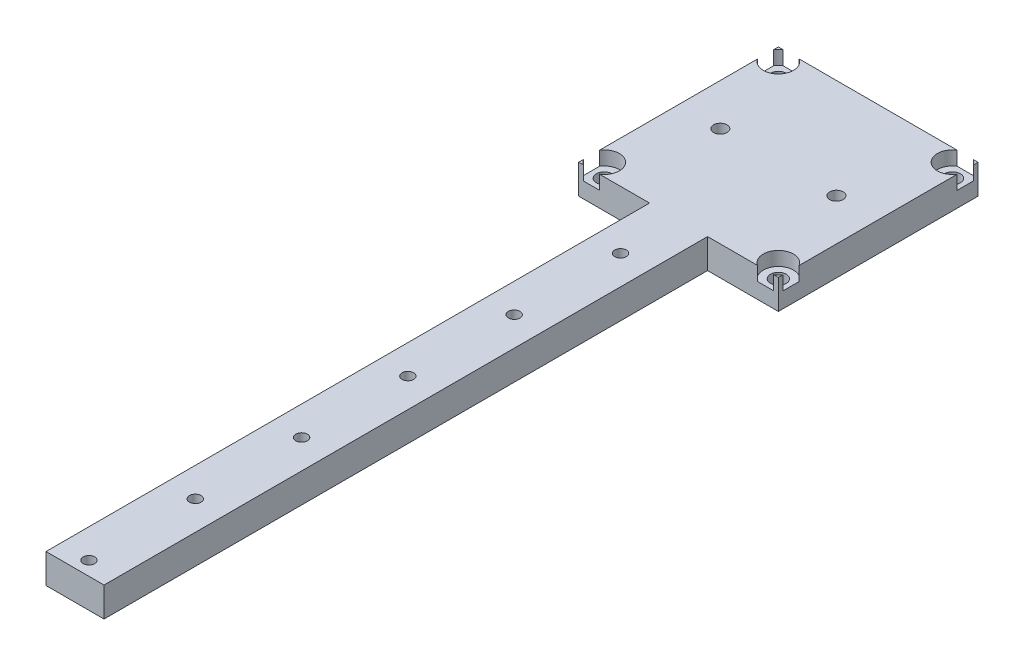
ISO-10303-21;
HEADER;
FILE_DESCRIPTION(('STEP AP214'),'2;1');
FILE_NAME('part.step','',(''),(''),'','','');
FILE_SCHEMA(('AUTOMOTIVE_DESIGN { 1 0 10303 214 1 1 1 1 }'));
ENDSEC;
DATA;
#1=APPLICATION_CONTEXT('core data for automotive mechanical design processes');
#2=APPLICATION_PROTOCOL_DEFINITION('international standard','automotive_design',2000,#1);
#3=PRODUCT_CONTEXT('',#1,'mechanical');
#4=PRODUCT('Part','Part','',(#3));
#5=PRODUCT_RELATED_PRODUCT_CATEGORY('part','',(#4));
#6=PRODUCT_DEFINITION_FORMATION('','',#4);
#7=PRODUCT_DEFINITION_CONTEXT('part definition',#1,'design');
#8=PRODUCT_DEFINITION('design','',#6,#7);
#9=PRODUCT_DEFINITION_SHAPE('','',#8);
#10=(LENGTH_UNIT() NAMED_UNIT(*) SI_UNIT(.MILLI.,.METRE.));
#11=(NAMED_UNIT(*) PLANE_ANGLE_UNIT() SI_UNIT($,.RADIAN.));
#12=(NAMED_UNIT(*) SI_UNIT($,.STERADIAN.) SOLID_ANGLE_UNIT());
#13=UNCERTAINTY_MEASURE_WITH_UNIT(LENGTH_MEASURE(1.E-05),#10,'distance_accuracy_value','');
#14=(GEOMETRIC_REPRESENTATION_CONTEXT(3) GLOBAL_UNCERTAINTY_ASSIGNED_CONTEXT((#13)) GLOBAL_UNIT_ASSIGNED_CONTEXT((#10,
#11,#12)) REPRESENTATION_CONTEXT('',''));
#15=CARTESIAN_POINT('',(0.,0.,0.));
#16=DIRECTION('',(0.,0.,1.));
#17=DIRECTION('',(1.,0.,0.));
#18=AXIS2_PLACEMENT_3D('',#15,#16,#17);
#19=CARTESIAN_POINT('',(21.5,6.35,-21.5));
#20=DIRECTION('',(0.,-1.,0.));
#21=DIRECTION('',(0.,0.,-1.));
#22=AXIS2_PLACEMENT_3D('',#19,#20,#21);
#23=PLANE('',#22);
#24=DIRECTION('',(0.,0.,-1.));
#25=VECTOR('',#24,1.);
#26=CARTESIAN_POINT('',(21.5,6.35,21.5));
#27=LINE('',#26,#25);
#28=CARTESIAN_POINT('',(21.5,6.35,21.5));
#29=VERTEX_POINT('',#28);
#30=CARTESIAN_POINT('',(21.5,6.35,20.4820508075689));
#31=VERTEX_POINT('',#30);
#32=EDGE_CURVE('E307',#29,#31,#27,.T.);
#33=ORIENTED_EDGE('',*,*,#32,.T.);
#34=CARTESIAN_POINT('',(18.75,6.35,18.75));
#35=DIRECTION('',(0.,1.,0.));
#36=DIRECTION('',(0.,0.,1.));
#37=AXIS2_PLACEMENT_3D('',#34,#35,#36);
#38=CIRCLE('',#37,3.25);
#39=CARTESIAN_POINT('',(20.4820508075689,6.35,21.5));
#40=VERTEX_POINT('',#39);
#41=EDGE_CURVE('E193',#40,#31,#38,.T.);
#42=ORIENTED_EDGE('',*,*,#41,.F.);
#43=DIRECTION('',(1.,0.,0.));
#44=VECTOR('',#43,1.);
#45=CARTESIAN_POINT('',(6.24999999999999,6.35,21.5));
#46=LINE('',#45,#44);
#47=EDGE_CURVE('E331',#40,#29,#46,.T.);
#48=ORIENTED_EDGE('',*,*,#47,.T.);
#49=EDGE_LOOP('',(#33,#42,#48));
#50=FACE_BOUND('',#49,.T.);
#51=ADVANCED_FACE('F31',(#50),#23,.F.);
#52=DIRECTION('',(-1.,0.,0.));
#53=VECTOR('',#52,1.);
#54=CARTESIAN_POINT('',(-21.5,6.35,-21.5));
#55=LINE('',#54,#53);
#56=CARTESIAN_POINT('',(21.5,6.35,-21.5));
#57=VERTEX_POINT('',#56);
#58=CARTESIAN_POINT('',(20.4820508075689,6.35,-21.5));
#59=VERTEX_POINT('',#58);
#60=EDGE_CURVE('E312',#57,#59,#55,.T.);
#61=ORIENTED_EDGE('',*,*,#60,.T.);
#62=CARTESIAN_POINT('',(18.75,6.35,-18.75));
#63=DIRECTION('',(0.,1.,0.));
#64=DIRECTION('',(0.,0.,1.));
#65=AXIS2_PLACEMENT_3D('',#62,#63,#64);
#66=CIRCLE('',#65,3.25);
#67=CARTESIAN_POINT('',(21.5,6.35,-20.4820508075689));
#68=VERTEX_POINT('',#67);
#69=EDGE_CURVE('E215',#68,#59,#66,.T.);
#70=ORIENTED_EDGE('',*,*,#69,.F.);
#71=EDGE_CURVE('E311',#68,#57,#27,.T.);
#72=ORIENTED_EDGE('',*,*,#71,.T.);
#73=EDGE_LOOP('',(#61,#70,#72));
#74=FACE_BOUND('',#73,.T.);
#75=ADVANCED_FACE('F455',(#74),#23,.F.);
#76=DIRECTION('',(1.,0.,0.));
#77=VECTOR('',#76,1.);
#78=CARTESIAN_POINT('',(-6.25000000000001,6.35,21.5));
#79=LINE('',#78,#77);
#80=CARTESIAN_POINT('',(-21.5,6.35,21.5));
#81=VERTEX_POINT('',#80);
#82=CARTESIAN_POINT('',(-20.4820508075689,6.35,21.5));
#83=VERTEX_POINT('',#82);
#84=EDGE_CURVE('E322',#81,#83,#79,.T.);
#85=ORIENTED_EDGE('',*,*,#84,.T.);
#86=CARTESIAN_POINT('',(-18.75,6.35,18.75));
#87=DIRECTION('',(0.,1.,0.));
#88=DIRECTION('',(0.,0.,1.));
#89=AXIS2_PLACEMENT_3D('',#86,#87,#88);
#90=CIRCLE('',#89,3.25);
#91=CARTESIAN_POINT('',(-21.5,6.35,20.4820508075689));
#92=VERTEX_POINT('',#91);
#93=EDGE_CURVE('E236',#92,#83,#90,.T.);
#94=ORIENTED_EDGE('',*,*,#93,.F.);
#95=DIRECTION('',(0.,0.,1.));
#96=VECTOR('',#95,1.);
#97=CARTESIAN_POINT('',(-21.5,6.35,21.5));
#98=LINE('',#97,#96);
#99=EDGE_CURVE('E315',#92,#81,#98,.T.);
#100=ORIENTED_EDGE('',*,*,#99,.T.);
#101=EDGE_LOOP('',(#85,#94,#100));
#102=FACE_BOUND('',#101,.T.);
#103=ADVANCED_FACE('F461',(#102),#23,.F.);
#104=CARTESIAN_POINT('',(-12.5,6.35,0.));
#105=DIRECTION('',(0.,1.,0.));
#106=DIRECTION('',(0.,0.,1.));
#107=AXIS2_PLACEMENT_3D('',#104,#105,#106);
#108=CIRCLE('',#107,1.44999999999999);
#109=CARTESIAN_POINT('',(-12.5,6.35,1.44999999999999));
#110=VERTEX_POINT('',#109);
#111=EDGE_CURVE('E487',#110,#110,#108,.T.);
#112=ORIENTED_EDGE('',*,*,#111,.F.);
#113=EDGE_LOOP('',(#112));
#114=FACE_BOUND('',#113,.T.);
#115=CARTESIAN_POINT('',(12.5,6.35,0.));
#116=DIRECTION('',(0.,1.,0.));
#117=DIRECTION('',(0.,0.,1.));
#118=AXIS2_PLACEMENT_3D('',#115,#116,#117);
#119=CIRCLE('',#118,1.44999999999999);
#120=CARTESIAN_POINT('',(12.5,6.35,1.44999999999999));
#121=VERTEX_POINT('',#120);
#122=EDGE_CURVE('E491',#121,#121,#119,.T.);
#123=ORIENTED_EDGE('',*,*,#122,.F.);
#124=EDGE_LOOP('',(#123));
#125=FACE_BOUND('',#124,.T.);
#126=CARTESIAN_POINT('',(0.,6.35,148.5));
#127=DIRECTION('',(0.,1.,0.));
#128=DIRECTION('',(0.,0.,1.));
#129=AXIS2_PLACEMENT_3D('',#126,#127,#128);
#130=CIRCLE('',#129,1.24999999999999);
#131=CARTESIAN_POINT('',(0.,6.35,149.75));
#132=VERTEX_POINT('',#131);
#133=EDGE_CURVE('E303',#132,#132,#130,.T.);
#134=ORIENTED_EDGE('',*,*,#133,.F.);
#135=EDGE_LOOP('',(#134));
#136=FACE_BOUND('',#135,.T.);
#137=CARTESIAN_POINT('',(0.,6.35,125.6));
#138=DIRECTION('',(0.,1.,0.));
#139=DIRECTION('',(0.,0.,1.));
#140=AXIS2_PLACEMENT_3D('',#137,#138,#139);
#141=CIRCLE('',#140,1.24999999999999);
#142=CARTESIAN_POINT('',(0.,6.35,126.85));
#143=VERTEX_POINT('',#142);
#144=EDGE_CURVE('E299',#143,#143,#141,.T.);
#145=ORIENTED_EDGE('',*,*,#144,.F.);
#146=EDGE_LOOP('',(#145));
#147=FACE_BOUND('',#146,.T.);
#148=CARTESIAN_POINT('',(0.,6.35,102.7));
#149=DIRECTION('',(0.,1.,0.));
#150=DIRECTION('',(0.,0.,1.));
#151=AXIS2_PLACEMENT_3D('',#148,#149,#150);
#152=CIRCLE('',#151,1.24999999999999);
#153=CARTESIAN_POINT('',(0.,6.35,103.95));
#154=VERTEX_POINT('',#153);
#155=EDGE_CURVE('E295',#154,#154,#152,.T.);
#156=ORIENTED_EDGE('',*,*,#155,.F.);
#157=EDGE_LOOP('',(#156));
#158=FACE_BOUND('',#157,.T.);
#159=CARTESIAN_POINT('',(0.,6.35,79.8));
#160=DIRECTION('',(0.,1.,0.));
#161=DIRECTION('',(0.,0.,1.));
#162=AXIS2_PLACEMENT_3D('',#159,#160,#161);
#163=CIRCLE('',#162,1.24999999999999);
#164=CARTESIAN_POINT('',(0.,6.35,81.05));
#165=VERTEX_POINT('',#164);
#166=EDGE_CURVE('E291',#165,#165,#163,.T.);
#167=ORIENTED_EDGE('',*,*,#166,.F.);
#168=EDGE_LOOP('',(#167));
#169=FACE_BOUND('',#168,.T.);
#170=CARTESIAN_POINT('',(0.,6.35,56.9));
#171=DIRECTION('',(0.,1.,0.));
#172=DIRECTION('',(0.,0.,1.));
#173=AXIS2_PLACEMENT_3D('',#170,#171,#172);
#174=CIRCLE('',#173,1.24999999999999);
#175=CARTESIAN_POINT('',(0.,6.35,58.15));
#176=VERTEX_POINT('',#175);
#177=EDGE_CURVE('E287',#176,#176,#174,.T.);
#178=ORIENTED_EDGE('',*,*,#177,.F.);
#179=EDGE_LOOP('',(#178));
#180=FACE_BOUND('',#179,.T.);
#181=CARTESIAN_POINT('',(0.,6.35,34.));
#182=DIRECTION('',(0.,1.,0.));
#183=DIRECTION('',(0.,0.,1.));
#184=AXIS2_PLACEMENT_3D('',#181,#182,#183);
#185=CIRCLE('',#184,1.24999999999999);
#186=CARTESIAN_POINT('',(0.,6.35,35.25));
#187=VERTEX_POINT('',#186);
#188=EDGE_CURVE('E283',#187,#187,#185,.T.);
#189=ORIENTED_EDGE('',*,*,#188,.F.);
#190=EDGE_LOOP('',(#189));
#191=FACE_BOUND('',#190,.T.);
#192=CARTESIAN_POINT('',(6.24999999999999,6.35,21.5));
#193=VERTEX_POINT('',#192);
#194=CARTESIAN_POINT('',(17.0179491924311,6.35,21.5));
#195=VERTEX_POINT('',#194);
#196=EDGE_CURVE('E332',#193,#195,#46,.T.);
#197=ORIENTED_EDGE('',*,*,#196,.T.);
#198=CARTESIAN_POINT('',(21.5,6.35,17.0179491924311));
#199=VERTEX_POINT('',#198);
#200=EDGE_CURVE('E420',#199,#195,#38,.T.);
#201=ORIENTED_EDGE('',*,*,#200,.F.);
#202=CARTESIAN_POINT('',(21.5,6.35,-17.0179491924311));
#203=VERTEX_POINT('',#202);
#204=EDGE_CURVE('E310',#199,#203,#27,.T.);
#205=ORIENTED_EDGE('',*,*,#204,.T.);
#206=CARTESIAN_POINT('',(17.0179491924311,6.35,-21.5));
#207=VERTEX_POINT('',#206);
#208=EDGE_CURVE('E212',#207,#203,#66,.T.);
#209=ORIENTED_EDGE('',*,*,#208,.F.);
#210=CARTESIAN_POINT('',(-17.0179491924311,6.35,-21.5));
#211=VERTEX_POINT('',#210);
#212=EDGE_CURVE('E316',#207,#211,#55,.T.);
#213=ORIENTED_EDGE('',*,*,#212,.T.);
#214=CARTESIAN_POINT('',(-18.75,6.35,-18.75));
#215=DIRECTION('',(0.,-1.,0.));
#216=DIRECTION('',(0.,0.,-1.));
#217=AXIS2_PLACEMENT_3D('',#214,#215,#216);
#218=CIRCLE('',#217,3.25);
#219=CARTESIAN_POINT('',(-21.5,6.35,-17.0179491924311));
#220=VERTEX_POINT('',#219);
#221=EDGE_CURVE('E391',#211,#220,#218,.T.);
#222=ORIENTED_EDGE('',*,*,#221,.T.);
#223=CARTESIAN_POINT('',(-21.5,6.35,17.0179491924311));
#224=VERTEX_POINT('',#223);
#225=EDGE_CURVE('E321',#220,#224,#98,.T.);
#226=ORIENTED_EDGE('',*,*,#225,.T.);
#227=CARTESIAN_POINT('',(-17.0179491924311,6.35,21.5));
#228=VERTEX_POINT('',#227);
#229=EDGE_CURVE('E237',#228,#224,#90,.T.);
#230=ORIENTED_EDGE('',*,*,#229,.F.);
#231=CARTESIAN_POINT('',(-6.25000000000001,6.35,21.5));
#232=VERTEX_POINT('',#231);
#233=EDGE_CURVE('E320',#228,#232,#79,.T.);
#234=ORIENTED_EDGE('',*,*,#233,.T.);
#235=DIRECTION('',(0.,0.,1.));
#236=VECTOR('',#235,1.);
#237=CARTESIAN_POINT('',(-6.25000000000001,6.35,21.5));
#238=LINE('',#237,#236);
#239=CARTESIAN_POINT('',(-6.24999999999999,6.35,151.5));
#240=VERTEX_POINT('',#239);
#241=EDGE_CURVE('E325',#232,#240,#238,.T.);
#242=ORIENTED_EDGE('',*,*,#241,.T.);
#243=DIRECTION('',(1.,0.,0.));
#244=VECTOR('',#243,1.);
#245=CARTESIAN_POINT('',(-6.24999999999999,6.35,151.5));
#246=LINE('',#245,#244);
#247=CARTESIAN_POINT('',(6.25000000000001,6.35,151.5));
#248=VERTEX_POINT('',#247);
#249=EDGE_CURVE('E327',#240,#248,#246,.T.);
#250=ORIENTED_EDGE('',*,*,#249,.T.);
#251=DIRECTION('',(0.,0.,-1.));
#252=VECTOR('',#251,1.);
#253=CARTESIAN_POINT('',(6.24999999999999,6.35,21.5));
#254=LINE('',#253,#252);
#255=EDGE_CURVE('E329',#248,#193,#254,.T.);
#256=ORIENTED_EDGE('',*,*,#255,.T.);
#257=EDGE_LOOP('',(#197,#201,#205,#209,#213,#222,#226,#230,#234,#242,#250,#256));
#258=FACE_BOUND('',#257,.T.);
#259=ADVANCED_FACE('F467',(#114,#125,#136,#147,#158,#169,#180,#191,#258),#23,.F.);
#260=CARTESIAN_POINT('',(21.5,6.35,21.5));
#261=DIRECTION('',(-1.,0.,0.));
#262=DIRECTION('',(0.,0.,1.));
#263=AXIS2_PLACEMENT_3D('',#260,#261,#262);
#264=PLANE('',#263);
#265=DIRECTION('',(0.,0.,1.));
#266=VECTOR('',#265,1.);
#267=CARTESIAN_POINT('',(21.5,3.35,21.5));
#268=LINE('',#267,#266);
#269=CARTESIAN_POINT('',(21.5,3.35,17.0179491924311));
#270=VERTEX_POINT('',#269);
#271=CARTESIAN_POINT('',(21.5,3.35,20.4820508075689));
#272=VERTEX_POINT('',#271);
#273=EDGE_CURVE('E198',#270,#272,#268,.T.);
#274=ORIENTED_EDGE('',*,*,#273,.T.);
#275=DIRECTION('',(0.,1.,0.));
#276=VECTOR('',#275,1.);
#277=CARTESIAN_POINT('',(21.5,6.35,20.4820508075689));
#278=LINE('',#277,#276);
#279=EDGE_CURVE('E190',#272,#31,#278,.T.);
#280=ORIENTED_EDGE('',*,*,#279,.T.);
#281=ORIENTED_EDGE('',*,*,#32,.F.);
#282=DIRECTION('',(0.,-1.,0.));
#283=VECTOR('',#282,1.);
#284=CARTESIAN_POINT('',(21.5,6.35,21.5));
#285=LINE('',#284,#283);
#286=CARTESIAN_POINT('',(21.5,0.,21.5));
#287=VERTEX_POINT('',#286);
#288=EDGE_CURVE('E335',#29,#287,#285,.T.);
#289=ORIENTED_EDGE('',*,*,#288,.T.);
#290=DIRECTION('',(0.,0.,-1.));
#291=VECTOR('',#290,1.);
#292=CARTESIAN_POINT('',(21.5,0.,21.5));
#293=LINE('',#292,#291);
#294=CARTESIAN_POINT('',(21.5,0.,-21.5));
#295=VERTEX_POINT('',#294);
#296=EDGE_CURVE('E336',#287,#295,#293,.T.);
#297=ORIENTED_EDGE('',*,*,#296,.T.);
#298=DIRECTION('',(0.,-1.,0.));
#299=VECTOR('',#298,1.);
#300=CARTESIAN_POINT('',(21.5,6.35,-21.5));
#301=LINE('',#300,#299);
#302=EDGE_CURVE('E373',#57,#295,#301,.T.);
#303=ORIENTED_EDGE('',*,*,#302,.F.);
#304=ORIENTED_EDGE('',*,*,#71,.F.);
#305=DIRECTION('',(0.,1.,0.));
#306=VECTOR('',#305,1.);
#307=CARTESIAN_POINT('',(21.5,6.35,-20.4820508075689));
#308=LINE('',#307,#306);
#309=CARTESIAN_POINT('',(21.5,3.35,-20.4820508075689));
#310=VERTEX_POINT('',#309);
#311=EDGE_CURVE('E227',#68,#310,#308,.F.);
#312=ORIENTED_EDGE('',*,*,#311,.T.);
#313=DIRECTION('',(0.,0.,1.));
#314=VECTOR('',#313,1.);
#315=CARTESIAN_POINT('',(21.5,3.35,21.5));
#316=LINE('',#315,#314);
#317=CARTESIAN_POINT('',(21.5,3.35,-17.0179491924311));
#318=VERTEX_POINT('',#317);
#319=EDGE_CURVE('E233',#310,#318,#316,.T.);
#320=ORIENTED_EDGE('',*,*,#319,.T.);
#321=DIRECTION('',(0.,1.,0.));
#322=VECTOR('',#321,1.);
#323=CARTESIAN_POINT('',(21.5,6.35,-17.0179491924311));
#324=LINE('',#323,#322);
#325=EDGE_CURVE('E230',#318,#203,#324,.T.);
#326=ORIENTED_EDGE('',*,*,#325,.T.);
#327=ORIENTED_EDGE('',*,*,#204,.F.);
#328=DIRECTION('',(0.,1.,0.));
#329=VECTOR('',#328,1.);
#330=CARTESIAN_POINT('',(21.5,6.35,17.0179491924311));
#331=LINE('',#330,#329);
#332=EDGE_CURVE('E199',#199,#270,#331,.F.);
#333=ORIENTED_EDGE('',*,*,#332,.T.);
#334=EDGE_LOOP('',(#274,#280,#281,#289,#297,#303,#304,#312,#320,#326,#327,#333));
#335=FACE_BOUND('',#334,.T.);
#336=ADVANCED_FACE('F33',(#335),#264,.F.);
#337=CARTESIAN_POINT('',(-21.5,6.35,-21.5));
#338=DIRECTION('',(0.,0.,1.));
#339=DIRECTION('',(1.,0.,0.));
#340=AXIS2_PLACEMENT_3D('',#337,#338,#339);
#341=PLANE('',#340);
#342=DIRECTION('',(1.,0.,0.));
#343=VECTOR('',#342,1.);
#344=CARTESIAN_POINT('',(-21.5,3.35,-21.5));
#345=LINE('',#344,#343);
#346=CARTESIAN_POINT('',(17.0179491924311,3.35,-21.5));
#347=VERTEX_POINT('',#346);
#348=CARTESIAN_POINT('',(20.4820508075689,3.35,-21.5));
#349=VERTEX_POINT('',#348);
#350=EDGE_CURVE('E407',#347,#349,#345,.T.);
#351=ORIENTED_EDGE('',*,*,#350,.T.);
#352=DIRECTION('',(0.,1.,0.));
#353=VECTOR('',#352,1.);
#354=CARTESIAN_POINT('',(20.4820508075689,6.35,-21.5));
#355=LINE('',#354,#353);
#356=EDGE_CURVE('E410',#349,#59,#355,.T.);
#357=ORIENTED_EDGE('',*,*,#356,.T.);
#358=ORIENTED_EDGE('',*,*,#60,.F.);
#359=ORIENTED_EDGE('',*,*,#302,.T.);
#360=DIRECTION('',(-1.,0.,0.));
#361=VECTOR('',#360,1.);
#362=CARTESIAN_POINT('',(-21.5,0.,-21.5));
#363=LINE('',#362,#361);
#364=CARTESIAN_POINT('',(-21.5,0.,-21.5));
#365=VERTEX_POINT('',#364);
#366=EDGE_CURVE('E339',#295,#365,#363,.T.);
#367=ORIENTED_EDGE('',*,*,#366,.T.);
#368=DIRECTION('',(0.,-1.,0.));
#369=VECTOR('',#368,1.);
#370=CARTESIAN_POINT('',(-21.5,6.35,-21.5));
#371=LINE('',#370,#369);
#372=CARTESIAN_POINT('',(-21.5,6.35,-21.5));
#373=VERTEX_POINT('',#372);
#374=EDGE_CURVE('E370',#373,#365,#371,.T.);
#375=ORIENTED_EDGE('',*,*,#374,.F.);
#376=CARTESIAN_POINT('',(-20.4820508075689,6.35,-21.5));
#377=VERTEX_POINT('',#376);
#378=EDGE_CURVE('E309',#377,#373,#55,.T.);
#379=ORIENTED_EDGE('',*,*,#378,.F.);
#380=DIRECTION('',(0.,1.,0.));
#381=VECTOR('',#380,1.);
#382=CARTESIAN_POINT('',(-20.4820508075689,6.35,-21.5));
#383=LINE('',#382,#381);
#384=CARTESIAN_POINT('',(-20.4820508075689,3.35,-21.5));
#385=VERTEX_POINT('',#384);
#386=EDGE_CURVE('E274',#377,#385,#383,.F.);
#387=ORIENTED_EDGE('',*,*,#386,.T.);
#388=DIRECTION('',(1.,0.,0.));
#389=VECTOR('',#388,1.);
#390=CARTESIAN_POINT('',(-21.5,3.35,-21.5));
#391=LINE('',#390,#389);
#392=CARTESIAN_POINT('',(-17.0179491924311,3.35,-21.5));
#393=VERTEX_POINT('',#392);
#394=EDGE_CURVE('E280',#385,#393,#391,.T.);
#395=ORIENTED_EDGE('',*,*,#394,.T.);
#396=DIRECTION('',(0.,1.,0.));
#397=VECTOR('',#396,1.);
#398=CARTESIAN_POINT('',(-17.0179491924311,6.35,-21.5));
#399=LINE('',#398,#397);
#400=EDGE_CURVE('E277',#393,#211,#399,.T.);
#401=ORIENTED_EDGE('',*,*,#400,.T.);
#402=ORIENTED_EDGE('',*,*,#212,.F.);
#403=DIRECTION('',(0.,1.,0.));
#404=VECTOR('',#403,1.);
#405=CARTESIAN_POINT('',(17.0179491924311,6.35,-21.5));
#406=LINE('',#405,#404);
#407=EDGE_CURVE('E404',#207,#347,#406,.F.);
#408=ORIENTED_EDGE('',*,*,#407,.T.);
#409=EDGE_LOOP('',(#351,#357,#358,#359,#367,#375,#379,#387,#395,#401,#402,#408));
#410=FACE_BOUND('',#409,.T.);
#411=ADVANCED_FACE('F482',(#410),#341,.F.);
#412=CARTESIAN_POINT('',(-21.5,6.35,21.5));
#413=DIRECTION('',(1.,0.,0.));
#414=DIRECTION('',(0.,0.,-1.));
#415=AXIS2_PLACEMENT_3D('',#412,#413,#414);
#416=PLANE('',#415);
#417=DIRECTION('',(0.,0.,-1.));
#418=VECTOR('',#417,1.);
#419=CARTESIAN_POINT('',(-21.5,3.35,21.5));
#420=LINE('',#419,#418);
#421=CARTESIAN_POINT('',(-21.5,3.35,20.4820508075689));
#422=VERTEX_POINT('',#421);
#423=CARTESIAN_POINT('',(-21.5,3.35,17.0179491924311));
#424=VERTEX_POINT('',#423);
#425=EDGE_CURVE('E255',#422,#424,#420,.T.);
#426=ORIENTED_EDGE('',*,*,#425,.T.);
#427=DIRECTION('',(0.,1.,0.));
#428=VECTOR('',#427,1.);
#429=CARTESIAN_POINT('',(-21.5,6.35,17.0179491924311));
#430=LINE('',#429,#428);
#431=EDGE_CURVE('E252',#424,#224,#430,.T.);
#432=ORIENTED_EDGE('',*,*,#431,.T.);
#433=ORIENTED_EDGE('',*,*,#225,.F.);
#434=DIRECTION('',(0.,1.,0.));
#435=VECTOR('',#434,1.);
#436=CARTESIAN_POINT('',(-21.5,6.35,-17.0179491924311));
#437=LINE('',#436,#435);
#438=CARTESIAN_POINT('',(-21.5,3.35,-17.0179491924311));
#439=VERTEX_POINT('',#438);
#440=EDGE_CURVE('E268',#220,#439,#437,.F.);
#441=ORIENTED_EDGE('',*,*,#440,.T.);
#442=DIRECTION('',(0.,0.,-1.));
#443=VECTOR('',#442,1.);
#444=CARTESIAN_POINT('',(-21.5,3.35,21.5));
#445=LINE('',#444,#443);
#446=CARTESIAN_POINT('',(-21.5,3.35,-20.4820508075689));
#447=VERTEX_POINT('',#446);
#448=EDGE_CURVE('E392',#439,#447,#445,.T.);
#449=ORIENTED_EDGE('',*,*,#448,.T.);
#450=DIRECTION('',(0.,1.,0.));
#451=VECTOR('',#450,1.);
#452=CARTESIAN_POINT('',(-21.5,6.35,-20.4820508075689));
#453=LINE('',#452,#451);
#454=CARTESIAN_POINT('',(-21.5,6.35,-20.4820508075689));
#455=VERTEX_POINT('',#454);
#456=EDGE_CURVE('E271',#447,#455,#453,.T.);
#457=ORIENTED_EDGE('',*,*,#456,.T.);
#458=EDGE_CURVE('E317',#373,#455,#98,.T.);
#459=ORIENTED_EDGE('',*,*,#458,.F.);
#460=ORIENTED_EDGE('',*,*,#374,.T.);
#461=DIRECTION('',(0.,0.,1.));
#462=VECTOR('',#461,1.);
#463=CARTESIAN_POINT('',(-21.5,0.,21.5));
#464=LINE('',#463,#462);
#465=CARTESIAN_POINT('',(-21.5,0.,21.5));
#466=VERTEX_POINT('',#465);
#467=EDGE_CURVE('E341',#365,#466,#464,.T.);
#468=ORIENTED_EDGE('',*,*,#467,.T.);
#469=DIRECTION('',(0.,-1.,0.));
#470=VECTOR('',#469,1.);
#471=CARTESIAN_POINT('',(-21.5,6.35,21.5));
#472=LINE('',#471,#470);
#473=EDGE_CURVE('E367',#81,#466,#472,.T.);
#474=ORIENTED_EDGE('',*,*,#473,.F.);
#475=ORIENTED_EDGE('',*,*,#99,.F.);
#476=DIRECTION('',(0.,1.,0.));
#477=VECTOR('',#476,1.);
#478=CARTESIAN_POINT('',(-21.5,6.35,20.4820508075689));
#479=LINE('',#478,#477);
#480=EDGE_CURVE('E249',#92,#422,#479,.F.);
#481=ORIENTED_EDGE('',*,*,#480,.T.);
#482=EDGE_LOOP('',(#426,#432,#433,#441,#449,#457,#459,#460,#468,#474,#475,#481));
#483=FACE_BOUND('',#482,.T.);
#484=ADVANCED_FACE('F783',(#483),#416,.F.);
#485=CARTESIAN_POINT('',(-6.25000000000001,6.35,21.5));
#486=DIRECTION('',(0.,0.,-1.));
#487=DIRECTION('',(-1.,0.,0.));
#488=AXIS2_PLACEMENT_3D('',#485,#486,#487);
#489=PLANE('',#488);
#490=DIRECTION('',(-1.,0.,0.));
#491=VECTOR('',#490,1.);
#492=CARTESIAN_POINT('',(-6.25000000000001,3.35,21.5));
#493=LINE('',#492,#491);
#494=CARTESIAN_POINT('',(-17.0179491924311,3.35,21.5));
#495=VERTEX_POINT('',#494);
#496=CARTESIAN_POINT('',(-20.4820508075689,3.35,21.5));
#497=VERTEX_POINT('',#496);
#498=EDGE_CURVE('E398',#495,#497,#493,.T.);
#499=ORIENTED_EDGE('',*,*,#498,.T.);
#500=DIRECTION('',(0.,1.,0.));
#501=VECTOR('',#500,1.);
#502=CARTESIAN_POINT('',(-20.4820508075689,6.35,21.5));
#503=LINE('',#502,#501);
#504=EDGE_CURVE('E401',#497,#83,#503,.T.);
#505=ORIENTED_EDGE('',*,*,#504,.T.);
#506=ORIENTED_EDGE('',*,*,#84,.F.);
#507=ORIENTED_EDGE('',*,*,#473,.T.);
#508=DIRECTION('',(1.,0.,0.));
#509=VECTOR('',#508,1.);
#510=CARTESIAN_POINT('',(-6.25000000000001,0.,21.5));
#511=LINE('',#510,#509);
#512=CARTESIAN_POINT('',(-6.25000000000001,0.,21.5));
#513=VERTEX_POINT('',#512);
#514=EDGE_CURVE('E343',#466,#513,#511,.T.);
#515=ORIENTED_EDGE('',*,*,#514,.T.);
#516=DIRECTION('',(0.,-1.,0.));
#517=VECTOR('',#516,1.);
#518=CARTESIAN_POINT('',(-6.25000000000001,6.35,21.5));
#519=LINE('',#518,#517);
#520=EDGE_CURVE('E364',#232,#513,#519,.T.);
#521=ORIENTED_EDGE('',*,*,#520,.F.);
#522=ORIENTED_EDGE('',*,*,#233,.F.);
#523=DIRECTION('',(0.,1.,0.));
#524=VECTOR('',#523,1.);
#525=CARTESIAN_POINT('',(-17.0179491924311,6.35,21.5));
#526=LINE('',#525,#524);
#527=EDGE_CURVE('E395',#228,#495,#526,.F.);
#528=ORIENTED_EDGE('',*,*,#527,.T.);
#529=EDGE_LOOP('',(#499,#505,#506,#507,#515,#521,#522,#528));
#530=FACE_BOUND('',#529,.T.);
#531=ADVANCED_FACE('F775',(#530),#489,.F.);
#532=CARTESIAN_POINT('',(-6.25000000000001,6.35,21.5));
#533=DIRECTION('',(1.,0.,0.));
#534=DIRECTION('',(0.,0.,-1.));
#535=AXIS2_PLACEMENT_3D('',#532,#533,#534);
#536=PLANE('',#535);
#537=DIRECTION('',(0.,0.,1.));
#538=VECTOR('',#537,1.);
#539=CARTESIAN_POINT('',(-6.25000000000001,0.,21.5));
#540=LINE('',#539,#538);
#541=CARTESIAN_POINT('',(-6.24999999999999,0.,151.5));
#542=VERTEX_POINT('',#541);
#543=EDGE_CURVE('E345',#513,#542,#540,.T.);
#544=ORIENTED_EDGE('',*,*,#543,.T.);
#545=DIRECTION('',(0.,-1.,0.));
#546=VECTOR('',#545,1.);
#547=CARTESIAN_POINT('',(-6.24999999999999,6.35,151.5));
#548=LINE('',#547,#546);
#549=EDGE_CURVE('E361',#240,#542,#548,.T.);
#550=ORIENTED_EDGE('',*,*,#549,.F.);
#551=ORIENTED_EDGE('',*,*,#241,.F.);
#552=ORIENTED_EDGE('',*,*,#520,.T.);
#553=EDGE_LOOP('',(#544,#550,#551,#552));
#554=FACE_BOUND('',#553,.T.);
#555=ADVANCED_FACE('F766',(#554),#536,.F.);
#556=CARTESIAN_POINT('',(-6.24999999999999,6.35,151.5));
#557=DIRECTION('',(0.,0.,-1.));
#558=DIRECTION('',(-1.,0.,0.));
#559=AXIS2_PLACEMENT_3D('',#556,#557,#558);
#560=PLANE('',#559);
#561=DIRECTION('',(1.,0.,0.));
#562=VECTOR('',#561,1.);
#563=CARTESIAN_POINT('',(-6.24999999999999,0.,151.5));
#564=LINE('',#563,#562);
#565=CARTESIAN_POINT('',(6.25000000000001,0.,151.5));
#566=VERTEX_POINT('',#565);
#567=EDGE_CURVE('E347',#542,#566,#564,.T.);
#568=ORIENTED_EDGE('',*,*,#567,.T.);
#569=DIRECTION('',(0.,-1.,0.));
#570=VECTOR('',#569,1.);
#571=CARTESIAN_POINT('',(6.25000000000001,6.35,151.5));
#572=LINE('',#571,#570);
#573=EDGE_CURVE('E358',#248,#566,#572,.T.);
#574=ORIENTED_EDGE('',*,*,#573,.F.);
#575=ORIENTED_EDGE('',*,*,#249,.F.);
#576=ORIENTED_EDGE('',*,*,#549,.T.);
#577=EDGE_LOOP('',(#568,#574,#575,#576));
#578=FACE_BOUND('',#577,.T.);
#579=ADVANCED_FACE('F758',(#578),#560,.F.);
#580=CARTESIAN_POINT('',(6.24999999999999,6.35,21.5));
#581=DIRECTION('',(-1.,0.,0.));
#582=DIRECTION('',(0.,0.,1.));
#583=AXIS2_PLACEMENT_3D('',#580,#581,#582);
#584=PLANE('',#583);
#585=DIRECTION('',(0.,0.,-1.));
#586=VECTOR('',#585,1.);
#587=CARTESIAN_POINT('',(6.24999999999999,0.,21.5));
#588=LINE('',#587,#586);
#589=CARTESIAN_POINT('',(6.24999999999999,0.,21.5));
#590=VERTEX_POINT('',#589);
#591=EDGE_CURVE('E349',#566,#590,#588,.T.);
#592=ORIENTED_EDGE('',*,*,#591,.T.);
#593=DIRECTION('',(0.,-1.,0.));
#594=VECTOR('',#593,1.);
#595=CARTESIAN_POINT('',(6.24999999999999,6.35,21.5));
#596=LINE('',#595,#594);
#597=EDGE_CURVE('E355',#193,#590,#596,.T.);
#598=ORIENTED_EDGE('',*,*,#597,.F.);
#599=ORIENTED_EDGE('',*,*,#255,.F.);
#600=ORIENTED_EDGE('',*,*,#573,.T.);
#601=EDGE_LOOP('',(#592,#598,#599,#600));
#602=FACE_BOUND('',#601,.T.);
#603=ADVANCED_FACE('F474',(#602),#584,.F.);
#604=CARTESIAN_POINT('',(6.24999999999999,6.35,21.5));
#605=DIRECTION('',(0.,0.,-1.));
#606=DIRECTION('',(-1.,0.,0.));
#607=AXIS2_PLACEMENT_3D('',#604,#605,#606);
#608=PLANE('',#607);
#609=DIRECTION('',(-1.,0.,0.));
#610=VECTOR('',#609,1.);
#611=CARTESIAN_POINT('',(6.24999999999999,3.35,21.5));
#612=LINE('',#611,#610);
#613=CARTESIAN_POINT('',(20.4820508075689,3.35,21.5));
#614=VERTEX_POINT('',#613);
#615=CARTESIAN_POINT('',(17.0179491924311,3.35,21.5));
#616=VERTEX_POINT('',#615);
#617=EDGE_CURVE('E39',#614,#616,#612,.T.);
#618=ORIENTED_EDGE('',*,*,#617,.T.);
#619=DIRECTION('',(0.,1.,0.));
#620=VECTOR('',#619,1.);
#621=CARTESIAN_POINT('',(17.0179491924311,6.35,21.5));
#622=LINE('',#621,#620);
#623=EDGE_CURVE('E11',#616,#195,#622,.T.);
#624=ORIENTED_EDGE('',*,*,#623,.T.);
#625=ORIENTED_EDGE('',*,*,#196,.F.);
#626=ORIENTED_EDGE('',*,*,#597,.T.);
#627=DIRECTION('',(1.,0.,0.));
#628=VECTOR('',#627,1.);
#629=CARTESIAN_POINT('',(6.24999999999999,0.,21.5));
#630=LINE('',#629,#628);
#631=EDGE_CURVE('E351',#590,#287,#630,.T.);
#632=ORIENTED_EDGE('',*,*,#631,.T.);
#633=ORIENTED_EDGE('',*,*,#288,.F.);
#634=ORIENTED_EDGE('',*,*,#47,.F.);
#635=DIRECTION('',(0.,1.,0.));
#636=VECTOR('',#635,1.);
#637=CARTESIAN_POINT('',(20.4820508075689,6.35,21.5));
#638=LINE('',#637,#636);
#639=EDGE_CURVE('E413',#40,#614,#638,.F.);
#640=ORIENTED_EDGE('',*,*,#639,.T.);
#641=EDGE_LOOP('',(#618,#624,#625,#626,#632,#633,#634,#640));
#642=FACE_BOUND('',#641,.T.);
#643=ADVANCED_FACE('F415',(#642),#608,.F.);
#644=ORIENTED_EDGE('',*,*,#458,.T.);
#645=EDGE_CURVE('E376',#455,#377,#218,.T.);
#646=ORIENTED_EDGE('',*,*,#645,.T.);
#647=ORIENTED_EDGE('',*,*,#378,.T.);
#648=EDGE_LOOP('',(#644,#646,#647));
#649=FACE_BOUND('',#648,.T.);
#650=ADVANCED_FACE('F457',(#649),#23,.F.);
#651=CARTESIAN_POINT('',(21.5,0.,-21.5));
#652=DIRECTION('',(0.,-1.,0.));
#653=DIRECTION('',(0.,0.,-1.));
#654=AXIS2_PLACEMENT_3D('',#651,#652,#653);
#655=PLANE('',#654);
#656=CARTESIAN_POINT('',(-12.5,0.,0.));
#657=DIRECTION('',(0.,1.,0.));
#658=DIRECTION('',(0.,0.,1.));
#659=AXIS2_PLACEMENT_3D('',#656,#657,#658);
#660=CIRCLE('',#659,1.45);
#661=CARTESIAN_POINT('',(-12.5,0.,1.45));
#662=VERTEX_POINT('',#661);
#663=EDGE_CURVE('E726',#662,#662,#660,.T.);
#664=ORIENTED_EDGE('',*,*,#663,.T.);
#665=EDGE_LOOP('',(#664));
#666=FACE_BOUND('',#665,.T.);
#667=CARTESIAN_POINT('',(12.5,0.,0.));
#668=DIRECTION('',(0.,1.,0.));
#669=DIRECTION('',(0.,0.,1.));
#670=AXIS2_PLACEMENT_3D('',#667,#668,#669);
#671=CIRCLE('',#670,1.45);
#672=CARTESIAN_POINT('',(12.5,0.,1.45));
#673=VERTEX_POINT('',#672);
#674=EDGE_CURVE('E422',#673,#673,#671,.T.);
#675=ORIENTED_EDGE('',*,*,#674,.T.);
#676=EDGE_LOOP('',(#675));
#677=FACE_BOUND('',#676,.T.);
#678=CARTESIAN_POINT('',(18.75,0.,18.75));
#679=DIRECTION('',(0.,1.,0.));
#680=DIRECTION('',(0.,0.,1.));
#681=AXIS2_PLACEMENT_3D('',#678,#679,#680);
#682=CIRCLE('',#681,1.7);
#683=CARTESIAN_POINT('',(18.75,0.,20.45));
#684=VERTEX_POINT('',#683);
#685=EDGE_CURVE('E428',#684,#684,#682,.T.);
#686=ORIENTED_EDGE('',*,*,#685,.T.);
#687=EDGE_LOOP('',(#686));
#688=FACE_BOUND('',#687,.T.);
#689=CARTESIAN_POINT('',(18.75,0.,-18.75));
#690=DIRECTION('',(0.,1.,0.));
#691=DIRECTION('',(0.,0.,1.));
#692=AXIS2_PLACEMENT_3D('',#689,#690,#691);
#693=CIRCLE('',#692,1.7);
#694=CARTESIAN_POINT('',(18.75,0.,-17.05));
#695=VERTEX_POINT('',#694);
#696=EDGE_CURVE('E224',#695,#695,#693,.T.);
#697=ORIENTED_EDGE('',*,*,#696,.T.);
#698=EDGE_LOOP('',(#697));
#699=FACE_BOUND('',#698,.T.);
#700=CARTESIAN_POINT('',(-18.75,0.,18.75));
#701=DIRECTION('',(0.,1.,0.));
#702=DIRECTION('',(0.,0.,1.));
#703=AXIS2_PLACEMENT_3D('',#700,#701,#702);
#704=CIRCLE('',#703,1.7);
#705=CARTESIAN_POINT('',(-18.75,0.,20.45));
#706=VERTEX_POINT('',#705);
#707=EDGE_CURVE('E246',#706,#706,#704,.T.);
#708=ORIENTED_EDGE('',*,*,#707,.T.);
#709=EDGE_LOOP('',(#708));
#710=FACE_BOUND('',#709,.T.);
#711=CARTESIAN_POINT('',(-18.75,0.,-18.75));
#712=DIRECTION('',(0.,1.,0.));
#713=DIRECTION('',(0.,0.,1.));
#714=AXIS2_PLACEMENT_3D('',#711,#712,#713);
#715=CIRCLE('',#714,1.7);
#716=CARTESIAN_POINT('',(-18.75,0.,-17.05));
#717=VERTEX_POINT('',#716);
#718=EDGE_CURVE('E265',#717,#717,#715,.T.);
#719=ORIENTED_EDGE('',*,*,#718,.T.);
#720=EDGE_LOOP('',(#719));
#721=FACE_BOUND('',#720,.T.);
#722=CARTESIAN_POINT('',(0.,0.,34.));
#723=DIRECTION('',(0.,-1.,0.));
#724=DIRECTION('',(0.,0.,-1.));
#725=AXIS2_PLACEMENT_3D('',#722,#723,#724);
#726=CIRCLE('',#725,1.24999999999999);
#727=CARTESIAN_POINT('',(0.,0.,32.75));
#728=VERTEX_POINT('',#727);
#729=EDGE_CURVE('E286',#728,#728,#726,.T.);
#730=ORIENTED_EDGE('',*,*,#729,.F.);
#731=EDGE_LOOP('',(#730));
#732=FACE_BOUND('',#731,.T.);
#733=CARTESIAN_POINT('',(0.,0.,56.9));
#734=DIRECTION('',(0.,-1.,0.));
#735=DIRECTION('',(0.,0.,-1.));
#736=AXIS2_PLACEMENT_3D('',#733,#734,#735);
#737=CIRCLE('',#736,1.24999999999999);
#738=CARTESIAN_POINT('',(0.,0.,55.65));
#739=VERTEX_POINT('',#738);
#740=EDGE_CURVE('E290',#739,#739,#737,.T.);
#741=ORIENTED_EDGE('',*,*,#740,.F.);
#742=EDGE_LOOP('',(#741));
#743=FACE_BOUND('',#742,.T.);
#744=CARTESIAN_POINT('',(0.,0.,79.8));
#745=DIRECTION('',(0.,-1.,0.));
#746=DIRECTION('',(0.,0.,-1.));
#747=AXIS2_PLACEMENT_3D('',#744,#745,#746);
#748=CIRCLE('',#747,1.24999999999999);
#749=CARTESIAN_POINT('',(0.,0.,78.55));
#750=VERTEX_POINT('',#749);
#751=EDGE_CURVE('E294',#750,#750,#748,.T.);
#752=ORIENTED_EDGE('',*,*,#751,.F.);
#753=EDGE_LOOP('',(#752));
#754=FACE_BOUND('',#753,.T.);
#755=CARTESIAN_POINT('',(0.,0.,102.7));
#756=DIRECTION('',(0.,-1.,0.));
#757=DIRECTION('',(0.,0.,-1.));
#758=AXIS2_PLACEMENT_3D('',#755,#756,#757);
#759=CIRCLE('',#758,1.24999999999999);
#760=CARTESIAN_POINT('',(0.,0.,101.45));
#761=VERTEX_POINT('',#760);
#762=EDGE_CURVE('E298',#761,#761,#759,.T.);
#763=ORIENTED_EDGE('',*,*,#762,.F.);
#764=EDGE_LOOP('',(#763));
#765=FACE_BOUND('',#764,.T.);
#766=CARTESIAN_POINT('',(0.,0.,125.6));
#767=DIRECTION('',(0.,-1.,0.));
#768=DIRECTION('',(0.,0.,-1.));
#769=AXIS2_PLACEMENT_3D('',#766,#767,#768);
#770=CIRCLE('',#769,1.24999999999999);
#771=CARTESIAN_POINT('',(0.,0.,124.35));
#772=VERTEX_POINT('',#771);
#773=EDGE_CURVE('E302',#772,#772,#770,.T.);
#774=ORIENTED_EDGE('',*,*,#773,.F.);
#775=EDGE_LOOP('',(#774));
#776=FACE_BOUND('',#775,.T.);
#777=CARTESIAN_POINT('',(0.,0.,148.5));
#778=DIRECTION('',(0.,-1.,0.));
#779=DIRECTION('',(0.,0.,-1.));
#780=AXIS2_PLACEMENT_3D('',#777,#778,#779);
#781=CIRCLE('',#780,1.24999999999999);
#782=CARTESIAN_POINT('',(0.,0.,147.25));
#783=VERTEX_POINT('',#782);
#784=EDGE_CURVE('E306',#783,#783,#781,.T.);
#785=ORIENTED_EDGE('',*,*,#784,.F.);
#786=EDGE_LOOP('',(#785));
#787=FACE_BOUND('',#786,.T.);
#788=ORIENTED_EDGE('',*,*,#296,.F.);
#789=ORIENTED_EDGE('',*,*,#631,.F.);
#790=ORIENTED_EDGE('',*,*,#591,.F.);
#791=ORIENTED_EDGE('',*,*,#567,.F.);
#792=ORIENTED_EDGE('',*,*,#543,.F.);
#793=ORIENTED_EDGE('',*,*,#514,.F.);
#794=ORIENTED_EDGE('',*,*,#467,.F.);
#795=ORIENTED_EDGE('',*,*,#366,.F.);
#796=EDGE_LOOP('',(#788,#789,#790,#791,#792,#793,#794,#795));
#797=FACE_BOUND('',#796,.T.);
#798=ADVANCED_FACE('F432',(#666,#677,#688,#699,#710,#721,#732,#743,#754,#765,#776,#787,#797),
#655,.T.);
#799=CARTESIAN_POINT('',(0.,6.35,148.5));
#800=DIRECTION('',(0.,1.,0.));
#801=DIRECTION('',(0.,0.,1.));
#802=AXIS2_PLACEMENT_3D('',#799,#800,#801);
#803=CYLINDRICAL_SURFACE('',#802,1.24999999999999);
#804=ORIENTED_EDGE('',*,*,#784,.T.);
#805=EDGE_LOOP('',(#804));
#806=FACE_BOUND('',#805,.T.);
#807=ORIENTED_EDGE('',*,*,#133,.T.);
#808=EDGE_LOOP('',(#807));
#809=FACE_BOUND('',#808,.T.);
#810=ADVANCED_FACE('F472',(#806,#809),#803,.F.);
#811=CARTESIAN_POINT('',(0.,6.35,125.6));
#812=DIRECTION('',(0.,1.,0.));
#813=DIRECTION('',(0.,0.,1.));
#814=AXIS2_PLACEMENT_3D('',#811,#812,#813);
#815=CYLINDRICAL_SURFACE('',#814,1.24999999999999);
#816=ORIENTED_EDGE('',*,*,#773,.T.);
#817=EDGE_LOOP('',(#816));
#818=FACE_BOUND('',#817,.T.);
#819=ORIENTED_EDGE('',*,*,#144,.T.);
#820=EDGE_LOOP('',(#819));
#821=FACE_BOUND('',#820,.T.);
#822=ADVANCED_FACE('F578',(#818,#821),#815,.F.);
#823=CARTESIAN_POINT('',(0.,6.35,102.7));
#824=DIRECTION('',(0.,1.,0.));
#825=DIRECTION('',(0.,0.,1.));
#826=AXIS2_PLACEMENT_3D('',#823,#824,#825);
#827=CYLINDRICAL_SURFACE('',#826,1.24999999999999);
#828=ORIENTED_EDGE('',*,*,#762,.T.);
#829=EDGE_LOOP('',(#828));
#830=FACE_BOUND('',#829,.T.);
#831=ORIENTED_EDGE('',*,*,#155,.T.);
#832=EDGE_LOOP('',(#831));
#833=FACE_BOUND('',#832,.T.);
#834=ADVANCED_FACE('F574',(#830,#833),#827,.F.);
#835=CARTESIAN_POINT('',(0.,6.35,79.8));
#836=DIRECTION('',(0.,1.,0.));
#837=DIRECTION('',(0.,0.,1.));
#838=AXIS2_PLACEMENT_3D('',#835,#836,#837);
#839=CYLINDRICAL_SURFACE('',#838,1.24999999999999);
#840=ORIENTED_EDGE('',*,*,#751,.T.);
#841=EDGE_LOOP('',(#840));
#842=FACE_BOUND('',#841,.T.);
#843=ORIENTED_EDGE('',*,*,#166,.T.);
#844=EDGE_LOOP('',(#843));
#845=FACE_BOUND('',#844,.T.);
#846=ADVANCED_FACE('F570',(#842,#845),#839,.F.);
#847=CARTESIAN_POINT('',(0.,6.35,56.9));
#848=DIRECTION('',(0.,1.,0.));
#849=DIRECTION('',(0.,0.,1.));
#850=AXIS2_PLACEMENT_3D('',#847,#848,#849);
#851=CYLINDRICAL_SURFACE('',#850,1.24999999999999);
#852=ORIENTED_EDGE('',*,*,#740,.T.);
#853=EDGE_LOOP('',(#852));
#854=FACE_BOUND('',#853,.T.);
#855=ORIENTED_EDGE('',*,*,#177,.T.);
#856=EDGE_LOOP('',(#855));
#857=FACE_BOUND('',#856,.T.);
#858=ADVANCED_FACE('F566',(#854,#857),#851,.F.);
#859=CARTESIAN_POINT('',(0.,6.35,34.));
#860=DIRECTION('',(0.,1.,0.));
#861=DIRECTION('',(0.,0.,1.));
#862=AXIS2_PLACEMENT_3D('',#859,#860,#861);
#863=CYLINDRICAL_SURFACE('',#862,1.24999999999999);
#864=ORIENTED_EDGE('',*,*,#729,.T.);
#865=EDGE_LOOP('',(#864));
#866=FACE_BOUND('',#865,.T.);
#867=ORIENTED_EDGE('',*,*,#188,.T.);
#868=EDGE_LOOP('',(#867));
#869=FACE_BOUND('',#868,.T.);
#870=ADVANCED_FACE('F559',(#866,#869),#863,.F.);
#871=CARTESIAN_POINT('',(-17.05,3.35,-18.75));
#872=DIRECTION('',(0.,-1.,0.));
#873=DIRECTION('',(0.,0.,-1.));
#874=AXIS2_PLACEMENT_3D('',#871,#872,#873);
#875=PLANE('',#874);
#876=CARTESIAN_POINT('',(-18.75,3.35,-18.75));
#877=DIRECTION('',(0.,1.,0.));
#878=DIRECTION('',(0.,0.,1.));
#879=AXIS2_PLACEMENT_3D('',#876,#877,#878);
#880=CIRCLE('',#879,1.7);
#881=CARTESIAN_POINT('',(-18.75,3.35,-17.05));
#882=VERTEX_POINT('',#881);
#883=EDGE_CURVE('E262',#882,#882,#880,.T.);
#884=ORIENTED_EDGE('',*,*,#883,.F.);
#885=EDGE_LOOP('',(#884));
#886=FACE_BOUND('',#885,.T.);
#887=CARTESIAN_POINT('',(-18.75,3.35,-18.75));
#888=DIRECTION('',(0.,1.,0.));
#889=DIRECTION('',(0.,0.,1.));
#890=AXIS2_PLACEMENT_3D('',#887,#888,#889);
#891=CIRCLE('',#890,3.25);
#892=EDGE_CURVE('E261',#385,#447,#891,.T.);
#893=ORIENTED_EDGE('',*,*,#892,.T.);
#894=ORIENTED_EDGE('',*,*,#448,.F.);
#895=EDGE_CURVE('E258',#439,#393,#891,.T.);
#896=ORIENTED_EDGE('',*,*,#895,.T.);
#897=ORIENTED_EDGE('',*,*,#394,.F.);
#898=EDGE_LOOP('',(#893,#894,#896,#897));
#899=FACE_BOUND('',#898,.T.);
#900=ADVANCED_FACE('F555',(#886,#899),#875,.F.);
#901=CARTESIAN_POINT('',(-18.75,6.35,-18.75));
#902=DIRECTION('',(0.,1.,0.));
#903=DIRECTION('',(0.,0.,1.));
#904=AXIS2_PLACEMENT_3D('',#901,#902,#903);
#905=CYLINDRICAL_SURFACE('',#904,3.25);
#906=ORIENTED_EDGE('',*,*,#895,.F.);
#907=ORIENTED_EDGE('',*,*,#440,.F.);
#908=ORIENTED_EDGE('',*,*,#221,.F.);
#909=ORIENTED_EDGE('',*,*,#400,.F.);
#910=EDGE_LOOP('',(#906,#907,#908,#909));
#911=FACE_BOUND('',#910,.T.);
#912=ADVANCED_FACE('F551',(#911),#905,.F.);
#913=ORIENTED_EDGE('',*,*,#645,.F.);
#914=ORIENTED_EDGE('',*,*,#456,.F.);
#915=ORIENTED_EDGE('',*,*,#892,.F.);
#916=ORIENTED_EDGE('',*,*,#386,.F.);
#917=EDGE_LOOP('',(#913,#914,#915,#916));
#918=FACE_BOUND('',#917,.T.);
#919=ADVANCED_FACE('F554',(#918),#905,.F.);
#920=CARTESIAN_POINT('',(-18.75,6.35,-18.75));
#921=DIRECTION('',(0.,1.,0.));
#922=DIRECTION('',(0.,0.,1.));
#923=AXIS2_PLACEMENT_3D('',#920,#921,#922);
#924=CYLINDRICAL_SURFACE('',#923,1.7);
#925=ORIENTED_EDGE('',*,*,#718,.F.);
#926=EDGE_LOOP('',(#925));
#927=FACE_BOUND('',#926,.T.);
#928=ORIENTED_EDGE('',*,*,#883,.T.);
#929=EDGE_LOOP('',(#928));
#930=FACE_BOUND('',#929,.T.);
#931=ADVANCED_FACE('F546',(#927,#930),#924,.F.);
#932=CARTESIAN_POINT('',(-17.05,3.35,18.75));
#933=DIRECTION('',(0.,-1.,0.));
#934=DIRECTION('',(0.,0.,-1.));
#935=AXIS2_PLACEMENT_3D('',#932,#933,#934);
#936=PLANE('',#935);
#937=CARTESIAN_POINT('',(-18.75,3.35,18.75));
#938=DIRECTION('',(0.,1.,0.));
#939=DIRECTION('',(0.,0.,1.));
#940=AXIS2_PLACEMENT_3D('',#937,#938,#939);
#941=CIRCLE('',#940,1.7);
#942=CARTESIAN_POINT('',(-18.75,3.35,20.45));
#943=VERTEX_POINT('',#942);
#944=EDGE_CURVE('E243',#943,#943,#941,.T.);
#945=ORIENTED_EDGE('',*,*,#944,.F.);
#946=EDGE_LOOP('',(#945));
#947=FACE_BOUND('',#946,.T.);
#948=CARTESIAN_POINT('',(-18.75,3.35,18.75));
#949=DIRECTION('',(0.,1.,0.));
#950=DIRECTION('',(0.,0.,1.));
#951=AXIS2_PLACEMENT_3D('',#948,#949,#950);
#952=CIRCLE('',#951,3.25);
#953=EDGE_CURVE('E239',#422,#497,#952,.T.);
#954=ORIENTED_EDGE('',*,*,#953,.T.);
#955=ORIENTED_EDGE('',*,*,#498,.F.);
#956=EDGE_CURVE('E240',#495,#424,#952,.T.);
#957=ORIENTED_EDGE('',*,*,#956,.T.);
#958=ORIENTED_EDGE('',*,*,#425,.F.);
#959=EDGE_LOOP('',(#954,#955,#957,#958));
#960=FACE_BOUND('',#959,.T.);
#961=ADVANCED_FACE('F542',(#947,#960),#936,.F.);
#962=CARTESIAN_POINT('',(-18.75,6.35,18.75));
#963=DIRECTION('',(0.,1.,0.));
#964=DIRECTION('',(0.,0.,1.));
#965=AXIS2_PLACEMENT_3D('',#962,#963,#964);
#966=CYLINDRICAL_SURFACE('',#965,3.25);
#967=ORIENTED_EDGE('',*,*,#956,.F.);
#968=ORIENTED_EDGE('',*,*,#527,.F.);
#969=ORIENTED_EDGE('',*,*,#229,.T.);
#970=ORIENTED_EDGE('',*,*,#431,.F.);
#971=EDGE_LOOP('',(#967,#968,#969,#970));
#972=FACE_BOUND('',#971,.T.);
#973=ADVANCED_FACE('F538',(#972),#966,.F.);
#974=ORIENTED_EDGE('',*,*,#93,.T.);
#975=ORIENTED_EDGE('',*,*,#504,.F.);
#976=ORIENTED_EDGE('',*,*,#953,.F.);
#977=ORIENTED_EDGE('',*,*,#480,.F.);
#978=EDGE_LOOP('',(#974,#975,#976,#977));
#979=FACE_BOUND('',#978,.T.);
#980=ADVANCED_FACE('F541',(#979),#966,.F.);
#981=CARTESIAN_POINT('',(-18.75,6.35,18.75));
#982=DIRECTION('',(0.,1.,0.));
#983=DIRECTION('',(0.,0.,1.));
#984=AXIS2_PLACEMENT_3D('',#981,#982,#983);
#985=CYLINDRICAL_SURFACE('',#984,1.7);
#986=ORIENTED_EDGE('',*,*,#707,.F.);
#987=EDGE_LOOP('',(#986));
#988=FACE_BOUND('',#987,.T.);
#989=ORIENTED_EDGE('',*,*,#944,.T.);
#990=EDGE_LOOP('',(#989));
#991=FACE_BOUND('',#990,.T.);
#992=ADVANCED_FACE('F535',(#988,#991),#985,.F.);
#993=CARTESIAN_POINT('',(20.45,3.35,-18.75));
#994=DIRECTION('',(0.,-1.,0.));
#995=DIRECTION('',(0.,0.,-1.));
#996=AXIS2_PLACEMENT_3D('',#993,#994,#995);
#997=PLANE('',#996);
#998=CARTESIAN_POINT('',(18.75,3.35,-18.75));
#999=DIRECTION('',(0.,1.,0.));
#1000=DIRECTION('',(0.,0.,1.));
#1001=AXIS2_PLACEMENT_3D('',#998,#999,#1000);
#1002=CIRCLE('',#1001,1.7);
#1003=CARTESIAN_POINT('',(18.75,3.35,-17.05));
#1004=VERTEX_POINT('',#1003);
#1005=EDGE_CURVE('E221',#1004,#1004,#1002,.T.);
#1006=ORIENTED_EDGE('',*,*,#1005,.F.);
#1007=EDGE_LOOP('',(#1006));
#1008=FACE_BOUND('',#1007,.T.);
#1009=CARTESIAN_POINT('',(18.75,3.35,-18.75));
#1010=DIRECTION('',(0.,1.,0.));
#1011=DIRECTION('',(0.,0.,1.));
#1012=AXIS2_PLACEMENT_3D('',#1009,#1010,#1011);
#1013=CIRCLE('',#1012,3.25);
#1014=EDGE_CURVE('E220',#310,#349,#1013,.T.);
#1015=ORIENTED_EDGE('',*,*,#1014,.T.);
#1016=ORIENTED_EDGE('',*,*,#350,.F.);
#1017=EDGE_CURVE('E54',#347,#318,#1013,.T.);
#1018=ORIENTED_EDGE('',*,*,#1017,.T.);
#1019=ORIENTED_EDGE('',*,*,#319,.F.);
#1020=EDGE_LOOP('',(#1015,#1016,#1018,#1019));
#1021=FACE_BOUND('',#1020,.T.);
#1022=ADVANCED_FACE('F526',(#1008,#1021),#997,.F.);
#1023=CARTESIAN_POINT('',(18.75,6.35,-18.75));
#1024=DIRECTION('',(0.,1.,0.));
#1025=DIRECTION('',(0.,0.,1.));
#1026=AXIS2_PLACEMENT_3D('',#1023,#1024,#1025);
#1027=CYLINDRICAL_SURFACE('',#1026,3.25);
#1028=ORIENTED_EDGE('',*,*,#1017,.F.);
#1029=ORIENTED_EDGE('',*,*,#407,.F.);
#1030=ORIENTED_EDGE('',*,*,#208,.T.);
#1031=ORIENTED_EDGE('',*,*,#325,.F.);
#1032=EDGE_LOOP('',(#1028,#1029,#1030,#1031));
#1033=FACE_BOUND('',#1032,.T.);
#1034=ADVANCED_FACE('F522',(#1033),#1027,.F.);
#1035=ORIENTED_EDGE('',*,*,#69,.T.);
#1036=ORIENTED_EDGE('',*,*,#356,.F.);
#1037=ORIENTED_EDGE('',*,*,#1014,.F.);
#1038=ORIENTED_EDGE('',*,*,#311,.F.);
#1039=EDGE_LOOP('',(#1035,#1036,#1037,#1038));
#1040=FACE_BOUND('',#1039,.T.);
#1041=ADVANCED_FACE('F451',(#1040),#1027,.F.);
#1042=CARTESIAN_POINT('',(18.75,6.35,-18.75));
#1043=DIRECTION('',(0.,1.,0.));
#1044=DIRECTION('',(0.,0.,1.));
#1045=AXIS2_PLACEMENT_3D('',#1042,#1043,#1044);
#1046=CYLINDRICAL_SURFACE('',#1045,1.7);
#1047=ORIENTED_EDGE('',*,*,#696,.F.);
#1048=EDGE_LOOP('',(#1047));
#1049=FACE_BOUND('',#1048,.T.);
#1050=ORIENTED_EDGE('',*,*,#1005,.T.);
#1051=EDGE_LOOP('',(#1050));
#1052=FACE_BOUND('',#1051,.T.);
#1053=ADVANCED_FACE('F444',(#1049,#1052),#1046,.F.);
#1054=CARTESIAN_POINT('',(20.45,3.35,18.75));
#1055=DIRECTION('',(0.,-1.,0.));
#1056=DIRECTION('',(0.,0.,-1.));
#1057=AXIS2_PLACEMENT_3D('',#1054,#1055,#1056);
#1058=PLANE('',#1057);
#1059=CARTESIAN_POINT('',(18.75,3.35,18.75));
#1060=DIRECTION('',(0.,1.,0.));
#1061=DIRECTION('',(0.,0.,1.));
#1062=AXIS2_PLACEMENT_3D('',#1059,#1060,#1061);
#1063=CIRCLE('',#1062,1.7);
#1064=CARTESIAN_POINT('',(18.75,3.35,20.45));
#1065=VERTEX_POINT('',#1064);
#1066=EDGE_CURVE('E207',#1065,#1065,#1063,.T.);
#1067=ORIENTED_EDGE('',*,*,#1066,.F.);
#1068=EDGE_LOOP('',(#1067));
#1069=FACE_BOUND('',#1068,.T.);
#1070=CARTESIAN_POINT('',(18.75,3.35,18.75));
#1071=DIRECTION('',(0.,1.,0.));
#1072=DIRECTION('',(0.,0.,1.));
#1073=AXIS2_PLACEMENT_3D('',#1070,#1071,#1072);
#1074=CIRCLE('',#1073,3.25);
#1075=EDGE_CURVE('E208',#270,#616,#1074,.T.);
#1076=ORIENTED_EDGE('',*,*,#1075,.T.);
#1077=ORIENTED_EDGE('',*,*,#617,.F.);
#1078=EDGE_CURVE('E46',#614,#272,#1074,.T.);
#1079=ORIENTED_EDGE('',*,*,#1078,.T.);
#1080=ORIENTED_EDGE('',*,*,#273,.F.);
#1081=EDGE_LOOP('',(#1076,#1077,#1079,#1080));
#1082=FACE_BOUND('',#1081,.T.);
#1083=ADVANCED_FACE('F203',(#1069,#1082),#1058,.F.);
#1084=CARTESIAN_POINT('',(18.75,6.35,18.75));
#1085=DIRECTION('',(0.,1.,0.));
#1086=DIRECTION('',(0.,0.,1.));
#1087=AXIS2_PLACEMENT_3D('',#1084,#1085,#1086);
#1088=CYLINDRICAL_SURFACE('',#1087,3.25);
#1089=ORIENTED_EDGE('',*,*,#1078,.F.);
#1090=ORIENTED_EDGE('',*,*,#639,.F.);
#1091=ORIENTED_EDGE('',*,*,#41,.T.);
#1092=ORIENTED_EDGE('',*,*,#279,.F.);
#1093=EDGE_LOOP('',(#1089,#1090,#1091,#1092));
#1094=FACE_BOUND('',#1093,.T.);
#1095=ADVANCED_FACE('F191',(#1094),#1088,.F.);
#1096=ORIENTED_EDGE('',*,*,#200,.T.);
#1097=ORIENTED_EDGE('',*,*,#623,.F.);
#1098=ORIENTED_EDGE('',*,*,#1075,.F.);
#1099=ORIENTED_EDGE('',*,*,#332,.F.);
#1100=EDGE_LOOP('',(#1096,#1097,#1098,#1099));
#1101=FACE_BOUND('',#1100,.T.);
#1102=ADVANCED_FACE('F439',(#1101),#1088,.F.);
#1103=CARTESIAN_POINT('',(18.75,6.35,18.75));
#1104=DIRECTION('',(0.,1.,0.));
#1105=DIRECTION('',(0.,0.,1.));
#1106=AXIS2_PLACEMENT_3D('',#1103,#1104,#1105);
#1107=CYLINDRICAL_SURFACE('',#1106,1.7);
#1108=ORIENTED_EDGE('',*,*,#685,.F.);
#1109=EDGE_LOOP('',(#1108));
#1110=FACE_BOUND('',#1109,.T.);
#1111=ORIENTED_EDGE('',*,*,#1066,.T.);
#1112=EDGE_LOOP('',(#1111));
#1113=FACE_BOUND('',#1112,.T.);
#1114=ADVANCED_FACE('F435',(#1110,#1113),#1107,.F.);
#1115=CARTESIAN_POINT('',(12.5,6.35,0.));
#1116=DIRECTION('',(0.,1.,0.));
#1117=DIRECTION('',(0.,0.,1.));
#1118=AXIS2_PLACEMENT_3D('',#1115,#1116,#1117);
#1119=CYLINDRICAL_SURFACE('',#1118,1.44999999999999);
#1120=ORIENTED_EDGE('',*,*,#674,.F.);
#1121=EDGE_LOOP('',(#1120));
#1122=FACE_BOUND('',#1121,.T.);
#1123=ORIENTED_EDGE('',*,*,#122,.T.);
#1124=EDGE_LOOP('',(#1123));
#1125=FACE_BOUND('',#1124,.T.);
#1126=ADVANCED_FACE('F438',(#1122,#1125),#1119,.F.);
#1127=CARTESIAN_POINT('',(-12.5,6.35,0.));
#1128=DIRECTION('',(0.,1.,0.));
#1129=DIRECTION('',(0.,0.,1.));
#1130=AXIS2_PLACEMENT_3D('',#1127,#1128,#1129);
#1131=CYLINDRICAL_SURFACE('',#1130,1.44999999999999);
#1132=ORIENTED_EDGE('',*,*,#663,.F.);
#1133=EDGE_LOOP('',(#1132));
#1134=FACE_BOUND('',#1133,.T.);
#1135=ORIENTED_EDGE('',*,*,#111,.T.);
#1136=EDGE_LOOP('',(#1135));
#1137=FACE_BOUND('',#1136,.T.);
#1138=ADVANCED_FACE('F709',(#1134,#1137),#1131,.F.);
#1139=CLOSED_SHELL('',(#51,#75,#103,#259,#336,#411,#484,#531,#555,#579,#603,#643,#650,#798,#810,
#822,#834,#846,#858,#870,#900,#912,#919,#931,#961,#973,#980,#992,#1022,#1034,#1041,#1053,#1083,
#1095,#1102,#1114,#1126,#1138));
#1140=MANIFOLD_SOLID_BREP('B2',#1139);
#1141=ADVANCED_BREP_SHAPE_REPRESENTATION('',(#18,#1140),#14);
#1142=SHAPE_DEFINITION_REPRESENTATION(#9,#1141);
ENDSEC;
END-ISO-10303-21;
